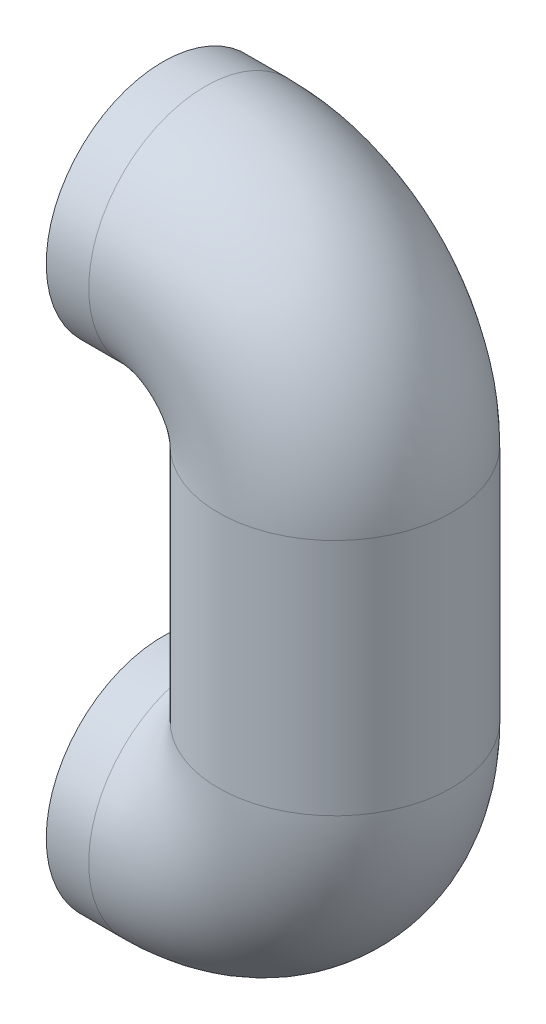
ISO-10303-21;
HEADER;
FILE_DESCRIPTION(('STEP AP214'),'2;1');
FILE_NAME('part.step','',(''),(''),'','','');
FILE_SCHEMA(('AUTOMOTIVE_DESIGN { 1 0 10303 214 1 1 1 1 }'));
ENDSEC;
DATA;
#1=APPLICATION_CONTEXT('core data for automotive mechanical design processes');
#2=APPLICATION_PROTOCOL_DEFINITION('international standard','automotive_design',2000,#1);
#3=PRODUCT_CONTEXT('',#1,'mechanical');
#4=PRODUCT('Part','Part','',(#3));
#5=PRODUCT_RELATED_PRODUCT_CATEGORY('part','',(#4));
#6=PRODUCT_DEFINITION_FORMATION('','',#4);
#7=PRODUCT_DEFINITION_CONTEXT('part definition',#1,'design');
#8=PRODUCT_DEFINITION('design','',#6,#7);
#9=PRODUCT_DEFINITION_SHAPE('','',#8);
#10=(LENGTH_UNIT() NAMED_UNIT(*) SI_UNIT(.MILLI.,.METRE.));
#11=(NAMED_UNIT(*) PLANE_ANGLE_UNIT() SI_UNIT($,.RADIAN.));
#12=(NAMED_UNIT(*) SI_UNIT($,.STERADIAN.) SOLID_ANGLE_UNIT());
#13=UNCERTAINTY_MEASURE_WITH_UNIT(LENGTH_MEASURE(1.E-05),#10,'distance_accuracy_value','');
#14=(GEOMETRIC_REPRESENTATION_CONTEXT(3) GLOBAL_UNCERTAINTY_ASSIGNED_CONTEXT((#13)) GLOBAL_UNIT_ASSIGNED_CONTEXT((#10,
#11,#12)) REPRESENTATION_CONTEXT('',''));
#15=CARTESIAN_POINT('',(0.,0.,0.));
#16=DIRECTION('',(0.,0.,1.));
#17=DIRECTION('',(1.,0.,0.));
#18=AXIS2_PLACEMENT_3D('',#15,#16,#17);
#19=CARTESIAN_POINT('',(0.,0.,0.));
#20=DIRECTION('',(1.,0.,0.));
#21=DIRECTION('',(0.,0.,-1.));
#22=AXIS2_PLACEMENT_3D('',#19,#20,#21);
#23=PLANE('',#22);
#24=CARTESIAN_POINT('',(0.,0.,0.));
#25=DIRECTION('',(1.,0.,0.));
#26=DIRECTION('',(0.,0.,-1.));
#27=AXIS2_PLACEMENT_3D('',#24,#25,#26);
#28=CIRCLE('',#27,22.5);
#29=CARTESIAN_POINT('',(0.,0.,-22.5));
#30=VERTEX_POINT('',#29);
#31=EDGE_CURVE('E37',#30,#30,#28,.T.);
#32=ORIENTED_EDGE('',*,*,#31,.F.);
#33=EDGE_LOOP('',(#32));
#34=FACE_BOUND('',#33,.T.);
#35=ADVANCED_FACE('F15',(#34),#23,.F.);
#36=CARTESIAN_POINT('',(0.,96.,0.));
#37=DIRECTION('',(-1.,0.,0.));
#38=DIRECTION('',(0.,0.,-1.));
#39=AXIS2_PLACEMENT_3D('',#36,#37,#38);
#40=PLANE('',#39);
#41=CARTESIAN_POINT('',(0.,96.,0.));
#42=DIRECTION('',(-1.,0.,0.));
#43=DIRECTION('',(0.,0.,-1.));
#44=AXIS2_PLACEMENT_3D('',#41,#42,#43);
#45=CIRCLE('',#44,22.5);
#46=CARTESIAN_POINT('',(0.,96.,-22.5));
#47=VERTEX_POINT('',#46);
#48=EDGE_CURVE('E10',#47,#47,#45,.T.);
#49=ORIENTED_EDGE('',*,*,#48,.T.);
#50=EDGE_LOOP('',(#49));
#51=FACE_BOUND('',#50,.T.);
#52=ADVANCED_FACE('F44',(#51),#40,.T.);
#53=CARTESIAN_POINT('',(0.,0.,0.));
#54=DIRECTION('',(1.,0.,0.));
#55=DIRECTION('',(0.,0.,-1.));
#56=AXIS2_PLACEMENT_3D('',#53,#54,#55);
#57=CYLINDRICAL_SURFACE('',#56,22.5);
#58=CARTESIAN_POINT('',(8.19999999999983,0.,0.));
#59=DIRECTION('',(1.,0.,0.));
#60=DIRECTION('',(0.,0.,-1.));
#61=AXIS2_PLACEMENT_3D('',#58,#59,#60);
#62=CIRCLE('',#61,22.5);
#63=CARTESIAN_POINT('',(8.19999999999968,-22.5,0.));
#64=VERTEX_POINT('',#63);
#65=EDGE_CURVE('E34',#64,#64,#62,.T.);
#66=ORIENTED_EDGE('',*,*,#65,.F.);
#67=EDGE_LOOP('',(#66));
#68=FACE_BOUND('',#67,.T.);
#69=ORIENTED_EDGE('',*,*,#31,.T.);
#70=EDGE_LOOP('',(#69));
#71=FACE_BOUND('',#70,.T.);
#72=ADVANCED_FACE('F41',(#68,#71),#57,.T.);
#73=CARTESIAN_POINT('',(8.2,25.,0.));
#74=DIRECTION('',(0.,0.,1.));
#75=DIRECTION('',(1.,0.,0.));
#76=AXIS2_PLACEMENT_3D('',#73,#74,#75);
#77=TOROIDAL_SURFACE('',#76,25.,22.5);
#78=CARTESIAN_POINT('',(33.2,25.,0.));
#79=DIRECTION('',(0.,1.,0.));
#80=DIRECTION('',(0.,0.,-1.));
#81=AXIS2_PLACEMENT_3D('',#78,#79,#80);
#82=CIRCLE('',#81,22.5);
#83=CARTESIAN_POINT('',(55.7,25.,0.));
#84=VERTEX_POINT('',#83);
#85=EDGE_CURVE('E29',#84,#84,#82,.T.);
#86=CARTESIAN_POINT('',(8.2,25.,0.));
#87=DIRECTION('',(0.,0.,1.));
#88=DIRECTION('',(1.,0.,0.));
#89=AXIS2_PLACEMENT_3D('',#86,#87,#88);
#90=CIRCLE('',#89,47.5);
#91=EDGE_CURVE('',#64,#84,#90,.T.);
#92=ORIENTED_EDGE('',*,*,#65,.T.);
#93=ORIENTED_EDGE('',*,*,#85,.F.);
#94=ORIENTED_EDGE('',*,*,#91,.T.);
#95=ORIENTED_EDGE('',*,*,#91,.F.);
#96=EDGE_LOOP('',(#92,#94,#93,#95));
#97=FACE_BOUND('',#96,.T.);
#98=ADVANCED_FACE('F65',(#97),#77,.T.);
#99=CARTESIAN_POINT('',(33.2,25.,0.));
#100=DIRECTION('',(0.,1.,0.));
#101=DIRECTION('',(0.,0.,1.));
#102=AXIS2_PLACEMENT_3D('',#99,#100,#101);
#103=CYLINDRICAL_SURFACE('',#102,22.5);
#104=CARTESIAN_POINT('',(33.2,71.,0.));
#105=DIRECTION('',(0.,1.,0.));
#106=DIRECTION('',(0.,0.,-1.));
#107=AXIS2_PLACEMENT_3D('',#104,#105,#106);
#108=CIRCLE('',#107,22.5);
#109=CARTESIAN_POINT('',(55.7,71.,0.));
#110=VERTEX_POINT('',#109);
#111=EDGE_CURVE('E25',#110,#110,#108,.T.);
#112=ORIENTED_EDGE('',*,*,#111,.F.);
#113=EDGE_LOOP('',(#112));
#114=FACE_BOUND('',#113,.T.);
#115=ORIENTED_EDGE('',*,*,#85,.T.);
#116=EDGE_LOOP('',(#115));
#117=FACE_BOUND('',#116,.T.);
#118=ADVANCED_FACE('F59',(#114,#117),#103,.T.);
#119=CARTESIAN_POINT('',(8.2,71.,0.));
#120=DIRECTION('',(0.,0.,1.));
#121=DIRECTION('',(1.,0.,0.));
#122=AXIS2_PLACEMENT_3D('',#119,#120,#121);
#123=TOROIDAL_SURFACE('',#122,25.,22.5);
#124=CARTESIAN_POINT('',(8.19999999999983,96.,0.));
#125=DIRECTION('',(-1.,0.,0.));
#126=DIRECTION('',(0.,0.,-1.));
#127=AXIS2_PLACEMENT_3D('',#124,#125,#126);
#128=CIRCLE('',#127,22.5);
#129=CARTESIAN_POINT('',(8.19999999999968,118.5,0.));
#130=VERTEX_POINT('',#129);
#131=EDGE_CURVE('E21',#130,#130,#128,.T.);
#132=CARTESIAN_POINT('',(8.2,71.,0.));
#133=DIRECTION('',(0.,0.,1.));
#134=DIRECTION('',(1.,0.,0.));
#135=AXIS2_PLACEMENT_3D('',#132,#133,#134);
#136=CIRCLE('',#135,47.5);
#137=EDGE_CURVE('',#110,#130,#136,.T.);
#138=ORIENTED_EDGE('',*,*,#111,.T.);
#139=ORIENTED_EDGE('',*,*,#131,.F.);
#140=ORIENTED_EDGE('',*,*,#137,.T.);
#141=ORIENTED_EDGE('',*,*,#137,.F.);
#142=EDGE_LOOP('',(#138,#140,#139,#141));
#143=FACE_BOUND('',#142,.T.);
#144=ADVANCED_FACE('F52',(#143),#123,.T.);
#145=CARTESIAN_POINT('',(8.19999999999983,96.,0.));
#146=DIRECTION('',(-1.,0.,0.));
#147=DIRECTION('',(0.,0.,1.));
#148=AXIS2_PLACEMENT_3D('',#145,#146,#147);
#149=CYLINDRICAL_SURFACE('',#148,22.5);
#150=ORIENTED_EDGE('',*,*,#48,.F.);
#151=EDGE_LOOP('',(#150));
#152=FACE_BOUND('',#151,.T.);
#153=ORIENTED_EDGE('',*,*,#131,.T.);
#154=EDGE_LOOP('',(#153));
#155=FACE_BOUND('',#154,.T.);
#156=ADVANCED_FACE('F50',(#152,#155),#149,.T.);
#157=CLOSED_SHELL('',(#35,#52,#72,#98,#118,#144,#156));
#158=MANIFOLD_SOLID_BREP('B1',#157);
#159=ADVANCED_BREP_SHAPE_REPRESENTATION('',(#18,#158),#14);
#160=SHAPE_DEFINITION_REPRESENTATION(#9,#159);
ENDSEC;
END-ISO-10303-21;
